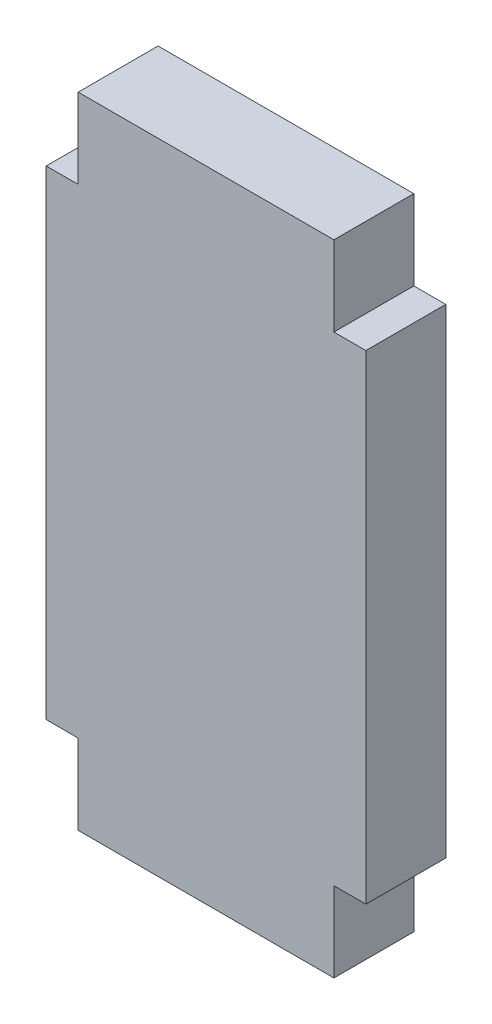
ISO-10303-21;
HEADER;
FILE_DESCRIPTION(('STEP AP214'),'2;1');
FILE_NAME('part.step','',(''),(''),'','','');
FILE_SCHEMA(('AUTOMOTIVE_DESIGN { 1 0 10303 214 1 1 1 1 }'));
ENDSEC;
DATA;
#1=APPLICATION_CONTEXT('core data for automotive mechanical design processes');
#2=APPLICATION_PROTOCOL_DEFINITION('international standard','automotive_design',2000,#1);
#3=PRODUCT_CONTEXT('',#1,'mechanical');
#4=PRODUCT('Part','Part','',(#3));
#5=PRODUCT_RELATED_PRODUCT_CATEGORY('part','',(#4));
#6=PRODUCT_DEFINITION_FORMATION('','',#4);
#7=PRODUCT_DEFINITION_CONTEXT('part definition',#1,'design');
#8=PRODUCT_DEFINITION('design','',#6,#7);
#9=PRODUCT_DEFINITION_SHAPE('','',#8);
#10=(LENGTH_UNIT() NAMED_UNIT(*) SI_UNIT(.MILLI.,.METRE.));
#11=(NAMED_UNIT(*) PLANE_ANGLE_UNIT() SI_UNIT($,.RADIAN.));
#12=(NAMED_UNIT(*) SI_UNIT($,.STERADIAN.) SOLID_ANGLE_UNIT());
#13=UNCERTAINTY_MEASURE_WITH_UNIT(LENGTH_MEASURE(1.E-05),#10,'distance_accuracy_value','');
#14=(GEOMETRIC_REPRESENTATION_CONTEXT(3) GLOBAL_UNCERTAINTY_ASSIGNED_CONTEXT((#13)) GLOBAL_UNIT_ASSIGNED_CONTEXT((#10,
#11,#12)) REPRESENTATION_CONTEXT('',''));
#15=CARTESIAN_POINT('',(0.,0.,0.));
#16=DIRECTION('',(0.,0.,1.));
#17=DIRECTION('',(1.,0.,0.));
#18=AXIS2_PLACEMENT_3D('',#15,#16,#17);
#19=CARTESIAN_POINT('',(-8.,-15.,5.));
#20=DIRECTION('',(1.,0.,0.));
#21=DIRECTION('',(0.,1.,0.));
#22=AXIS2_PLACEMENT_3D('',#19,#20,#21);
#23=PLANE('',#22);
#24=DIRECTION('',(0.,-1.,0.));
#25=VECTOR('',#24,1.);
#26=CARTESIAN_POINT('',(-8.,-15.,0.));
#27=LINE('',#26,#25);
#28=CARTESIAN_POINT('',(-8.,-15.,0.));
#29=VERTEX_POINT('',#28);
#30=CARTESIAN_POINT('',(-7.99999999999999,-20.,0.));
#31=VERTEX_POINT('',#30);
#32=EDGE_CURVE('E164',#29,#31,#27,.T.);
#33=ORIENTED_EDGE('',*,*,#32,.T.);
#34=DIRECTION('',(0.,0.,-1.));
#35=VECTOR('',#34,1.);
#36=CARTESIAN_POINT('',(-7.99999999999999,-20.,5.));
#37=LINE('',#36,#35);
#38=CARTESIAN_POINT('',(-7.99999999999999,-20.,5.));
#39=VERTEX_POINT('',#38);
#40=EDGE_CURVE('E11',#39,#31,#37,.T.);
#41=ORIENTED_EDGE('',*,*,#40,.F.);
#42=DIRECTION('',(0.,-1.,0.));
#43=VECTOR('',#42,1.);
#44=CARTESIAN_POINT('',(-8.,-15.,5.));
#45=LINE('',#44,#43);
#46=CARTESIAN_POINT('',(-8.,-15.,5.));
#47=VERTEX_POINT('',#46);
#48=EDGE_CURVE('E198',#47,#39,#45,.T.);
#49=ORIENTED_EDGE('',*,*,#48,.F.);
#50=DIRECTION('',(0.,0.,-1.));
#51=VECTOR('',#50,1.);
#52=CARTESIAN_POINT('',(-8.,-15.,5.));
#53=LINE('',#52,#51);
#54=EDGE_CURVE('E160',#47,#29,#53,.T.);
#55=ORIENTED_EDGE('',*,*,#54,.T.);
#56=EDGE_LOOP('',(#33,#41,#49,#55));
#57=FACE_BOUND('',#56,.T.);
#58=ADVANCED_FACE('F39',(#57),#23,.F.);
#59=CARTESIAN_POINT('',(8.00000000000001,-20.,5.));
#60=DIRECTION('',(0.,1.,0.));
#61=DIRECTION('',(0.,0.,1.));
#62=AXIS2_PLACEMENT_3D('',#59,#60,#61);
#63=PLANE('',#62);
#64=DIRECTION('',(1.,0.,0.));
#65=VECTOR('',#64,1.);
#66=CARTESIAN_POINT('',(8.00000000000001,-20.,0.));
#67=LINE('',#66,#65);
#68=CARTESIAN_POINT('',(8.00000000000001,-20.,0.));
#69=VERTEX_POINT('',#68);
#70=EDGE_CURVE('E168',#31,#69,#67,.T.);
#71=ORIENTED_EDGE('',*,*,#70,.T.);
#72=DIRECTION('',(0.,0.,-1.));
#73=VECTOR('',#72,1.);
#74=CARTESIAN_POINT('',(8.00000000000001,-20.,5.));
#75=LINE('',#74,#73);
#76=CARTESIAN_POINT('',(8.00000000000001,-20.,5.));
#77=VERTEX_POINT('',#76);
#78=EDGE_CURVE('E48',#77,#69,#75,.T.);
#79=ORIENTED_EDGE('',*,*,#78,.F.);
#80=DIRECTION('',(1.,0.,0.));
#81=VECTOR('',#80,1.);
#82=CARTESIAN_POINT('',(8.00000000000001,-20.,5.));
#83=LINE('',#82,#81);
#84=EDGE_CURVE('E111',#39,#77,#83,.T.);
#85=ORIENTED_EDGE('',*,*,#84,.F.);
#86=ORIENTED_EDGE('',*,*,#40,.T.);
#87=EDGE_LOOP('',(#71,#79,#85,#86));
#88=FACE_BOUND('',#87,.T.);
#89=ADVANCED_FACE('F292',(#88),#63,.F.);
#90=CARTESIAN_POINT('',(8.,-15.,5.));
#91=DIRECTION('',(-1.,0.,0.));
#92=DIRECTION('',(0.,-1.,0.));
#93=AXIS2_PLACEMENT_3D('',#90,#91,#92);
#94=PLANE('',#93);
#95=DIRECTION('',(0.,1.,0.));
#96=VECTOR('',#95,1.);
#97=CARTESIAN_POINT('',(8.,-15.,0.));
#98=LINE('',#97,#96);
#99=CARTESIAN_POINT('',(8.,-15.,0.));
#100=VERTEX_POINT('',#99);
#101=EDGE_CURVE('E171',#69,#100,#98,.T.);
#102=ORIENTED_EDGE('',*,*,#101,.T.);
#103=DIRECTION('',(0.,0.,-1.));
#104=VECTOR('',#103,1.);
#105=CARTESIAN_POINT('',(8.,-15.,5.));
#106=LINE('',#105,#104);
#107=CARTESIAN_POINT('',(8.,-15.,5.));
#108=VERTEX_POINT('',#107);
#109=EDGE_CURVE('E225',#108,#100,#106,.T.);
#110=ORIENTED_EDGE('',*,*,#109,.F.);
#111=DIRECTION('',(0.,1.,0.));
#112=VECTOR('',#111,1.);
#113=CARTESIAN_POINT('',(8.,-15.,5.));
#114=LINE('',#113,#112);
#115=EDGE_CURVE('E235',#77,#108,#114,.T.);
#116=ORIENTED_EDGE('',*,*,#115,.F.);
#117=ORIENTED_EDGE('',*,*,#78,.T.);
#118=EDGE_LOOP('',(#102,#110,#116,#117));
#119=FACE_BOUND('',#118,.T.);
#120=ADVANCED_FACE('F233',(#119),#94,.F.);
#121=CARTESIAN_POINT('',(10.,-15.,5.));
#122=DIRECTION('',(0.,1.,0.));
#123=DIRECTION('',(0.,0.,1.));
#124=AXIS2_PLACEMENT_3D('',#121,#122,#123);
#125=PLANE('',#124);
#126=DIRECTION('',(1.,0.,0.));
#127=VECTOR('',#126,1.);
#128=CARTESIAN_POINT('',(10.,-15.,0.));
#129=LINE('',#128,#127);
#130=CARTESIAN_POINT('',(10.,-15.,0.));
#131=VERTEX_POINT('',#130);
#132=EDGE_CURVE('E174',#100,#131,#129,.T.);
#133=ORIENTED_EDGE('',*,*,#132,.T.);
#134=DIRECTION('',(0.,0.,-1.));
#135=VECTOR('',#134,1.);
#136=CARTESIAN_POINT('',(10.,-15.,5.));
#137=LINE('',#136,#135);
#138=CARTESIAN_POINT('',(10.,-15.,5.));
#139=VERTEX_POINT('',#138);
#140=EDGE_CURVE('E221',#139,#131,#137,.T.);
#141=ORIENTED_EDGE('',*,*,#140,.F.);
#142=DIRECTION('',(1.,0.,0.));
#143=VECTOR('',#142,1.);
#144=CARTESIAN_POINT('',(10.,-15.,5.));
#145=LINE('',#144,#143);
#146=EDGE_CURVE('E254',#108,#139,#145,.T.);
#147=ORIENTED_EDGE('',*,*,#146,.F.);
#148=ORIENTED_EDGE('',*,*,#109,.T.);
#149=EDGE_LOOP('',(#133,#141,#147,#148));
#150=FACE_BOUND('',#149,.T.);
#151=ADVANCED_FACE('F244',(#150),#125,.F.);
#152=CARTESIAN_POINT('',(10.,15.,5.));
#153=DIRECTION('',(-1.,0.,0.));
#154=DIRECTION('',(0.,-1.,0.));
#155=AXIS2_PLACEMENT_3D('',#152,#153,#154);
#156=PLANE('',#155);
#157=DIRECTION('',(0.,1.,0.));
#158=VECTOR('',#157,1.);
#159=CARTESIAN_POINT('',(10.,15.,0.));
#160=LINE('',#159,#158);
#161=CARTESIAN_POINT('',(10.,15.,0.));
#162=VERTEX_POINT('',#161);
#163=EDGE_CURVE('E177',#131,#162,#160,.T.);
#164=ORIENTED_EDGE('',*,*,#163,.T.);
#165=DIRECTION('',(0.,0.,-1.));
#166=VECTOR('',#165,1.);
#167=CARTESIAN_POINT('',(10.,15.,5.));
#168=LINE('',#167,#166);
#169=CARTESIAN_POINT('',(10.,15.,5.));
#170=VERTEX_POINT('',#169);
#171=EDGE_CURVE('E217',#170,#162,#168,.T.);
#172=ORIENTED_EDGE('',*,*,#171,.F.);
#173=DIRECTION('',(0.,1.,0.));
#174=VECTOR('',#173,1.);
#175=CARTESIAN_POINT('',(10.,15.,5.));
#176=LINE('',#175,#174);
#177=EDGE_CURVE('E250',#139,#170,#176,.T.);
#178=ORIENTED_EDGE('',*,*,#177,.F.);
#179=ORIENTED_EDGE('',*,*,#140,.T.);
#180=EDGE_LOOP('',(#164,#172,#178,#179));
#181=FACE_BOUND('',#180,.T.);
#182=ADVANCED_FACE('F248',(#181),#156,.F.);
#183=CARTESIAN_POINT('',(10.,15.,5.));
#184=DIRECTION('',(0.,-1.,0.));
#185=DIRECTION('',(0.,0.,-1.));
#186=AXIS2_PLACEMENT_3D('',#183,#184,#185);
#187=PLANE('',#186);
#188=DIRECTION('',(-1.,0.,0.));
#189=VECTOR('',#188,1.);
#190=CARTESIAN_POINT('',(10.,15.,0.));
#191=LINE('',#190,#189);
#192=CARTESIAN_POINT('',(8.,15.,0.));
#193=VERTEX_POINT('',#192);
#194=EDGE_CURVE('E180',#162,#193,#191,.T.);
#195=ORIENTED_EDGE('',*,*,#194,.T.);
#196=DIRECTION('',(0.,0.,-1.));
#197=VECTOR('',#196,1.);
#198=CARTESIAN_POINT('',(8.,15.,5.));
#199=LINE('',#198,#197);
#200=CARTESIAN_POINT('',(8.,15.,5.));
#201=VERTEX_POINT('',#200);
#202=EDGE_CURVE('E213',#201,#193,#199,.T.);
#203=ORIENTED_EDGE('',*,*,#202,.F.);
#204=DIRECTION('',(-1.,0.,0.));
#205=VECTOR('',#204,1.);
#206=CARTESIAN_POINT('',(10.,15.,5.));
#207=LINE('',#206,#205);
#208=EDGE_CURVE('E253',#170,#201,#207,.T.);
#209=ORIENTED_EDGE('',*,*,#208,.F.);
#210=ORIENTED_EDGE('',*,*,#171,.T.);
#211=EDGE_LOOP('',(#195,#203,#209,#210));
#212=FACE_BOUND('',#211,.T.);
#213=ADVANCED_FACE('F305',(#212),#187,.F.);
#214=CARTESIAN_POINT('',(8.,20.,5.));
#215=DIRECTION('',(-1.,0.,0.));
#216=DIRECTION('',(0.,-1.,0.));
#217=AXIS2_PLACEMENT_3D('',#214,#215,#216);
#218=PLANE('',#217);
#219=DIRECTION('',(0.,1.,0.));
#220=VECTOR('',#219,1.);
#221=CARTESIAN_POINT('',(8.,20.,0.));
#222=LINE('',#221,#220);
#223=CARTESIAN_POINT('',(8.,20.,0.));
#224=VERTEX_POINT('',#223);
#225=EDGE_CURVE('E183',#193,#224,#222,.T.);
#226=ORIENTED_EDGE('',*,*,#225,.T.);
#227=DIRECTION('',(0.,0.,-1.));
#228=VECTOR('',#227,1.);
#229=CARTESIAN_POINT('',(8.,20.,5.));
#230=LINE('',#229,#228);
#231=CARTESIAN_POINT('',(8.,20.,5.));
#232=VERTEX_POINT('',#231);
#233=EDGE_CURVE('E209',#232,#224,#230,.T.);
#234=ORIENTED_EDGE('',*,*,#233,.F.);
#235=DIRECTION('',(0.,1.,0.));
#236=VECTOR('',#235,1.);
#237=CARTESIAN_POINT('',(8.,20.,5.));
#238=LINE('',#237,#236);
#239=EDGE_CURVE('E258',#201,#232,#238,.T.);
#240=ORIENTED_EDGE('',*,*,#239,.F.);
#241=ORIENTED_EDGE('',*,*,#202,.T.);
#242=EDGE_LOOP('',(#226,#234,#240,#241));
#243=FACE_BOUND('',#242,.T.);
#244=ADVANCED_FACE('F308',(#243),#218,.F.);
#245=CARTESIAN_POINT('',(8.,20.,5.));
#246=DIRECTION('',(0.,-1.,0.));
#247=DIRECTION('',(1.,0.,0.));
#248=AXIS2_PLACEMENT_3D('',#245,#246,#247);
#249=PLANE('',#248);
#250=DIRECTION('',(-1.,0.,0.));
#251=VECTOR('',#250,1.);
#252=CARTESIAN_POINT('',(8.,20.,0.));
#253=LINE('',#252,#251);
#254=CARTESIAN_POINT('',(-8.00000000000001,20.,0.));
#255=VERTEX_POINT('',#254);
#256=EDGE_CURVE('E186',#224,#255,#253,.T.);
#257=ORIENTED_EDGE('',*,*,#256,.T.);
#258=DIRECTION('',(0.,0.,-1.));
#259=VECTOR('',#258,1.);
#260=CARTESIAN_POINT('',(-8.00000000000001,20.,5.));
#261=LINE('',#260,#259);
#262=CARTESIAN_POINT('',(-8.00000000000001,20.,5.));
#263=VERTEX_POINT('',#262);
#264=EDGE_CURVE('E205',#263,#255,#261,.T.);
#265=ORIENTED_EDGE('',*,*,#264,.F.);
#266=DIRECTION('',(-1.,0.,0.));
#267=VECTOR('',#266,1.);
#268=CARTESIAN_POINT('',(8.,20.,5.));
#269=LINE('',#268,#267);
#270=EDGE_CURVE('E265',#232,#263,#269,.T.);
#271=ORIENTED_EDGE('',*,*,#270,.F.);
#272=ORIENTED_EDGE('',*,*,#233,.T.);
#273=EDGE_LOOP('',(#257,#265,#271,#272));
#274=FACE_BOUND('',#273,.T.);
#275=ADVANCED_FACE('F273',(#274),#249,.F.);
#276=CARTESIAN_POINT('',(-8.00000000000001,20.,5.));
#277=DIRECTION('',(1.,0.,0.));
#278=DIRECTION('',(0.,1.,0.));
#279=AXIS2_PLACEMENT_3D('',#276,#277,#278);
#280=PLANE('',#279);
#281=DIRECTION('',(0.,-1.,0.));
#282=VECTOR('',#281,1.);
#283=CARTESIAN_POINT('',(-8.00000000000001,20.,0.));
#284=LINE('',#283,#282);
#285=CARTESIAN_POINT('',(-8.,15.,0.));
#286=VERTEX_POINT('',#285);
#287=EDGE_CURVE('E189',#255,#286,#284,.T.);
#288=ORIENTED_EDGE('',*,*,#287,.T.);
#289=DIRECTION('',(0.,0.,-1.));
#290=VECTOR('',#289,1.);
#291=CARTESIAN_POINT('',(-8.,15.,5.));
#292=LINE('',#291,#290);
#293=CARTESIAN_POINT('',(-8.,15.,5.));
#294=VERTEX_POINT('',#293);
#295=EDGE_CURVE('E153',#294,#286,#292,.T.);
#296=ORIENTED_EDGE('',*,*,#295,.F.);
#297=DIRECTION('',(0.,-1.,0.));
#298=VECTOR('',#297,1.);
#299=CARTESIAN_POINT('',(-8.00000000000001,20.,5.));
#300=LINE('',#299,#298);
#301=EDGE_CURVE('E142',#263,#294,#300,.T.);
#302=ORIENTED_EDGE('',*,*,#301,.F.);
#303=ORIENTED_EDGE('',*,*,#264,.T.);
#304=EDGE_LOOP('',(#288,#296,#302,#303));
#305=FACE_BOUND('',#304,.T.);
#306=ADVANCED_FACE('F277',(#305),#280,.F.);
#307=CARTESIAN_POINT('',(-8.,15.,5.));
#308=DIRECTION('',(0.,-1.,0.));
#309=DIRECTION('',(0.,0.,-1.));
#310=AXIS2_PLACEMENT_3D('',#307,#308,#309);
#311=PLANE('',#310);
#312=DIRECTION('',(-1.,0.,0.));
#313=VECTOR('',#312,1.);
#314=CARTESIAN_POINT('',(-8.,15.,0.));
#315=LINE('',#314,#313);
#316=CARTESIAN_POINT('',(-10.,15.,0.));
#317=VERTEX_POINT('',#316);
#318=EDGE_CURVE('E151',#286,#317,#315,.T.);
#319=ORIENTED_EDGE('',*,*,#318,.T.);
#320=DIRECTION('',(0.,0.,-1.));
#321=VECTOR('',#320,1.);
#322=CARTESIAN_POINT('',(-10.,15.,5.));
#323=LINE('',#322,#321);
#324=CARTESIAN_POINT('',(-10.,15.,5.));
#325=VERTEX_POINT('',#324);
#326=EDGE_CURVE('E148',#325,#317,#323,.T.);
#327=ORIENTED_EDGE('',*,*,#326,.F.);
#328=DIRECTION('',(-1.,0.,0.));
#329=VECTOR('',#328,1.);
#330=CARTESIAN_POINT('',(-8.,15.,5.));
#331=LINE('',#330,#329);
#332=EDGE_CURVE('E136',#294,#325,#331,.T.);
#333=ORIENTED_EDGE('',*,*,#332,.F.);
#334=ORIENTED_EDGE('',*,*,#295,.T.);
#335=EDGE_LOOP('',(#319,#327,#333,#334));
#336=FACE_BOUND('',#335,.T.);
#337=ADVANCED_FACE('F149',(#336),#311,.F.);
#338=CARTESIAN_POINT('',(-10.,15.,5.));
#339=DIRECTION('',(1.,0.,0.));
#340=DIRECTION('',(0.,1.,0.));
#341=AXIS2_PLACEMENT_3D('',#338,#339,#340);
#342=PLANE('',#341);
#343=DIRECTION('',(0.,-1.,0.));
#344=VECTOR('',#343,1.);
#345=CARTESIAN_POINT('',(-10.,15.,0.));
#346=LINE('',#345,#344);
#347=CARTESIAN_POINT('',(-10.,-15.,0.));
#348=VERTEX_POINT('',#347);
#349=EDGE_CURVE('E97',#317,#348,#346,.T.);
#350=ORIENTED_EDGE('',*,*,#349,.T.);
#351=DIRECTION('',(0.,0.,-1.));
#352=VECTOR('',#351,1.);
#353=CARTESIAN_POINT('',(-10.,-15.,5.));
#354=LINE('',#353,#352);
#355=CARTESIAN_POINT('',(-10.,-15.,5.));
#356=VERTEX_POINT('',#355);
#357=EDGE_CURVE('E154',#356,#348,#354,.T.);
#358=ORIENTED_EDGE('',*,*,#357,.F.);
#359=DIRECTION('',(0.,-1.,0.));
#360=VECTOR('',#359,1.);
#361=CARTESIAN_POINT('',(-10.,15.,5.));
#362=LINE('',#361,#360);
#363=EDGE_CURVE('E140',#325,#356,#362,.T.);
#364=ORIENTED_EDGE('',*,*,#363,.F.);
#365=ORIENTED_EDGE('',*,*,#326,.T.);
#366=EDGE_LOOP('',(#350,#358,#364,#365));
#367=FACE_BOUND('',#366,.T.);
#368=ADVANCED_FACE('F156',(#367),#342,.F.);
#369=CARTESIAN_POINT('',(-8.,-15.,5.));
#370=DIRECTION('',(0.,1.,0.));
#371=DIRECTION('',(0.,0.,1.));
#372=AXIS2_PLACEMENT_3D('',#369,#370,#371);
#373=PLANE('',#372);
#374=DIRECTION('',(1.,0.,0.));
#375=VECTOR('',#374,1.);
#376=CARTESIAN_POINT('',(-8.,-15.,0.));
#377=LINE('',#376,#375);
#378=EDGE_CURVE('E103',#348,#29,#377,.T.);
#379=ORIENTED_EDGE('',*,*,#378,.T.);
#380=ORIENTED_EDGE('',*,*,#54,.F.);
#381=DIRECTION('',(1.,0.,0.));
#382=VECTOR('',#381,1.);
#383=CARTESIAN_POINT('',(-8.,-15.,5.));
#384=LINE('',#383,#382);
#385=EDGE_CURVE('E56',#356,#47,#384,.T.);
#386=ORIENTED_EDGE('',*,*,#385,.F.);
#387=ORIENTED_EDGE('',*,*,#357,.T.);
#388=EDGE_LOOP('',(#379,#380,#386,#387));
#389=FACE_BOUND('',#388,.T.);
#390=ADVANCED_FACE('F281',(#389),#373,.F.);
#391=CARTESIAN_POINT('',(0.,0.,5.));
#392=DIRECTION('',(0.,0.,-1.));
#393=DIRECTION('',(-1.,0.,0.));
#394=AXIS2_PLACEMENT_3D('',#391,#392,#393);
#395=PLANE('',#394);
#396=ORIENTED_EDGE('',*,*,#48,.T.);
#397=ORIENTED_EDGE('',*,*,#84,.T.);
#398=ORIENTED_EDGE('',*,*,#115,.T.);
#399=ORIENTED_EDGE('',*,*,#146,.T.);
#400=ORIENTED_EDGE('',*,*,#177,.T.);
#401=ORIENTED_EDGE('',*,*,#208,.T.);
#402=ORIENTED_EDGE('',*,*,#239,.T.);
#403=ORIENTED_EDGE('',*,*,#270,.T.);
#404=ORIENTED_EDGE('',*,*,#301,.T.);
#405=ORIENTED_EDGE('',*,*,#332,.T.);
#406=ORIENTED_EDGE('',*,*,#363,.T.);
#407=ORIENTED_EDGE('',*,*,#385,.T.);
#408=EDGE_LOOP('',(#396,#397,#398,#399,#400,#401,#402,#403,#404,#405,#406,#407));
#409=FACE_BOUND('',#408,.T.);
#410=ADVANCED_FACE('F138',(#409),#395,.F.);
#411=CARTESIAN_POINT('',(0.,0.,0.));
#412=DIRECTION('',(0.,0.,-1.));
#413=DIRECTION('',(-1.,0.,0.));
#414=AXIS2_PLACEMENT_3D('',#411,#412,#413);
#415=PLANE('',#414);
#416=ORIENTED_EDGE('',*,*,#32,.F.);
#417=ORIENTED_EDGE('',*,*,#378,.F.);
#418=ORIENTED_EDGE('',*,*,#349,.F.);
#419=ORIENTED_EDGE('',*,*,#318,.F.);
#420=ORIENTED_EDGE('',*,*,#287,.F.);
#421=ORIENTED_EDGE('',*,*,#256,.F.);
#422=ORIENTED_EDGE('',*,*,#225,.F.);
#423=ORIENTED_EDGE('',*,*,#194,.F.);
#424=ORIENTED_EDGE('',*,*,#163,.F.);
#425=ORIENTED_EDGE('',*,*,#132,.F.);
#426=ORIENTED_EDGE('',*,*,#101,.F.);
#427=ORIENTED_EDGE('',*,*,#70,.F.);
#428=EDGE_LOOP('',(#416,#417,#418,#419,#420,#421,#422,#423,#424,#425,#426,#427));
#429=FACE_BOUND('',#428,.T.);
#430=ADVANCED_FACE('F239',(#429),#415,.T.);
#431=CLOSED_SHELL('',(#58,#89,#120,#151,#182,#213,#244,#275,#306,#337,#368,#390,#410,#430));
#432=MANIFOLD_SOLID_BREP('B2',#431);
#433=ADVANCED_BREP_SHAPE_REPRESENTATION('',(#18,#432),#14);
#434=SHAPE_DEFINITION_REPRESENTATION(#9,#433);
ENDSEC;
END-ISO-10303-21;
